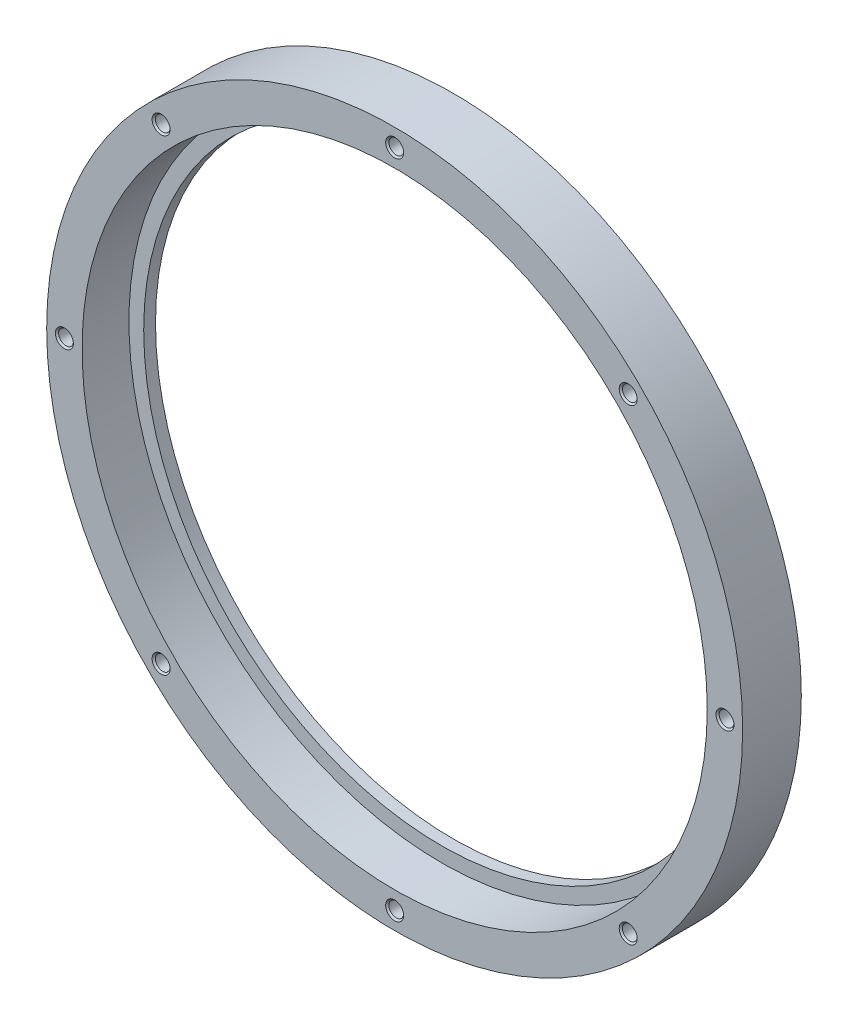
ISO-10303-21;
HEADER;
FILE_DESCRIPTION(('STEP AP214'),'2;1');
FILE_NAME('part.step','',(''),(''),'','','');
FILE_SCHEMA(('AUTOMOTIVE_DESIGN { 1 0 10303 214 1 1 1 1 }'));
ENDSEC;
DATA;
#1=APPLICATION_CONTEXT('core data for automotive mechanical design processes');
#2=APPLICATION_PROTOCOL_DEFINITION('international standard','automotive_design',2000,#1);
#3=PRODUCT_CONTEXT('',#1,'mechanical');
#4=PRODUCT('Part','Part','',(#3));
#5=PRODUCT_RELATED_PRODUCT_CATEGORY('part','',(#4));
#6=PRODUCT_DEFINITION_FORMATION('','',#4);
#7=PRODUCT_DEFINITION_CONTEXT('part definition',#1,'design');
#8=PRODUCT_DEFINITION('design','',#6,#7);
#9=PRODUCT_DEFINITION_SHAPE('','',#8);
#10=(LENGTH_UNIT() NAMED_UNIT(*) SI_UNIT(.MILLI.,.METRE.));
#11=(NAMED_UNIT(*) PLANE_ANGLE_UNIT() SI_UNIT($,.RADIAN.));
#12=(NAMED_UNIT(*) SI_UNIT($,.STERADIAN.) SOLID_ANGLE_UNIT());
#13=UNCERTAINTY_MEASURE_WITH_UNIT(LENGTH_MEASURE(1.E-05),#10,'distance_accuracy_value','');
#14=(GEOMETRIC_REPRESENTATION_CONTEXT(3) GLOBAL_UNCERTAINTY_ASSIGNED_CONTEXT((#13)) GLOBAL_UNIT_ASSIGNED_CONTEXT((#10,
#11,#12)) REPRESENTATION_CONTEXT('',''));
#15=CARTESIAN_POINT('',(0.,0.,0.));
#16=DIRECTION('',(0.,0.,1.));
#17=DIRECTION('',(1.,0.,0.));
#18=AXIS2_PLACEMENT_3D('',#15,#16,#17);
#19=CARTESIAN_POINT('',(0.,0.,3.975));
#20=DIRECTION('',(0.,0.,1.));
#21=DIRECTION('',(1.,0.,0.));
#22=AXIS2_PLACEMENT_3D('',#19,#20,#21);
#23=PLANE('',#22);
#24=CARTESIAN_POINT('',(-39.5979797464462,39.5979797464471,3.975));
#25=DIRECTION('',(0.,0.,1.));
#26=DIRECTION('',(1.,0.,0.));
#27=AXIS2_PLACEMENT_3D('',#24,#25,#26);
#28=CIRCLE('',#27,1.525);
#29=CARTESIAN_POINT('',(-38.0729797464462,39.5979797464471,3.975));
#30=VERTEX_POINT('',#29);
#31=EDGE_CURVE('E131',#30,#30,#28,.T.);
#32=ORIENTED_EDGE('',*,*,#31,.F.);
#33=EDGE_LOOP('',(#32));
#34=FACE_BOUND('',#33,.T.);
#35=CARTESIAN_POINT('',(-56.,5.86568864925646E-13,3.975));
#36=DIRECTION('',(0.,0.,1.));
#37=DIRECTION('',(1.,0.,0.));
#38=AXIS2_PLACEMENT_3D('',#35,#36,#37);
#39=CIRCLE('',#38,1.525);
#40=CARTESIAN_POINT('',(-54.475,5.86568864925646E-13,3.975));
#41=VERTEX_POINT('',#40);
#42=EDGE_CURVE('E122',#41,#41,#39,.T.);
#43=ORIENTED_EDGE('',*,*,#42,.F.);
#44=EDGE_LOOP('',(#43));
#45=FACE_BOUND('',#44,.T.);
#46=CARTESIAN_POINT('',(-39.597979746447,-39.5979797464463,3.975));
#47=DIRECTION('',(0.,0.,1.));
#48=DIRECTION('',(1.,0.,0.));
#49=AXIS2_PLACEMENT_3D('',#46,#47,#48);
#50=CIRCLE('',#49,1.525);
#51=CARTESIAN_POINT('',(-38.072979746447,-39.5979797464463,3.975));
#52=VERTEX_POINT('',#51);
#53=EDGE_CURVE('E113',#52,#52,#50,.T.);
#54=ORIENTED_EDGE('',*,*,#53,.F.);
#55=EDGE_LOOP('',(#54));
#56=FACE_BOUND('',#55,.T.);
#57=CARTESIAN_POINT('',(0.,-56.,3.975));
#58=DIRECTION('',(0.,0.,1.));
#59=DIRECTION('',(1.,0.,0.));
#60=AXIS2_PLACEMENT_3D('',#57,#58,#59);
#61=CIRCLE('',#60,1.525);
#62=CARTESIAN_POINT('',(1.525,-56.,3.975));
#63=VERTEX_POINT('',#62);
#64=EDGE_CURVE('E104',#63,#63,#61,.T.);
#65=ORIENTED_EDGE('',*,*,#64,.F.);
#66=EDGE_LOOP('',(#65));
#67=FACE_BOUND('',#66,.T.);
#68=CARTESIAN_POINT('',(39.5979797464464,-39.5979797464469,3.975));
#69=DIRECTION('',(0.,0.,1.));
#70=DIRECTION('',(1.,0.,0.));
#71=AXIS2_PLACEMENT_3D('',#68,#69,#70);
#72=CIRCLE('',#71,1.525);
#73=CARTESIAN_POINT('',(41.1229797464464,-39.5979797464469,3.975));
#74=VERTEX_POINT('',#73);
#75=EDGE_CURVE('E95',#74,#74,#72,.T.);
#76=ORIENTED_EDGE('',*,*,#75,.F.);
#77=EDGE_LOOP('',(#76));
#78=FACE_BOUND('',#77,.T.);
#79=CARTESIAN_POINT('',(56.,-1.95522954975215E-13,3.975));
#80=DIRECTION('',(0.,0.,1.));
#81=DIRECTION('',(1.,0.,0.));
#82=AXIS2_PLACEMENT_3D('',#79,#80,#81);
#83=CIRCLE('',#82,1.525);
#84=CARTESIAN_POINT('',(57.525,-1.95522954975215E-13,3.975));
#85=VERTEX_POINT('',#84);
#86=EDGE_CURVE('E86',#85,#85,#83,.T.);
#87=ORIENTED_EDGE('',*,*,#86,.F.);
#88=EDGE_LOOP('',(#87));
#89=FACE_BOUND('',#88,.T.);
#90=CARTESIAN_POINT('',(39.5979797464467,39.5979797464466,3.975));
#91=DIRECTION('',(0.,0.,1.));
#92=DIRECTION('',(1.,0.,0.));
#93=AXIS2_PLACEMENT_3D('',#90,#91,#92);
#94=CIRCLE('',#93,1.525);
#95=CARTESIAN_POINT('',(41.1229797464467,39.5979797464466,3.975));
#96=VERTEX_POINT('',#95);
#97=EDGE_CURVE('E77',#96,#96,#94,.T.);
#98=ORIENTED_EDGE('',*,*,#97,.F.);
#99=EDGE_LOOP('',(#98));
#100=FACE_BOUND('',#99,.T.);
#101=CARTESIAN_POINT('',(0.,56.,3.975));
#102=DIRECTION('',(0.,0.,1.));
#103=DIRECTION('',(1.,0.,0.));
#104=AXIS2_PLACEMENT_3D('',#101,#102,#103);
#105=CIRCLE('',#104,1.525);
#106=CARTESIAN_POINT('',(1.525,56.,3.975));
#107=VERTEX_POINT('',#106);
#108=EDGE_CURVE('E68',#107,#107,#105,.T.);
#109=ORIENTED_EDGE('',*,*,#108,.F.);
#110=EDGE_LOOP('',(#109));
#111=FACE_BOUND('',#110,.T.);
#112=CARTESIAN_POINT('',(0.,0.,3.975));
#113=DIRECTION('',(0.,0.,1.));
#114=DIRECTION('',(1.,0.,0.));
#115=AXIS2_PLACEMENT_3D('',#112,#113,#114);
#116=CIRCLE('',#115,59.);
#117=CARTESIAN_POINT('',(59.,0.,3.975));
#118=VERTEX_POINT('',#117);
#119=EDGE_CURVE('E10',#118,#118,#116,.T.);
#120=ORIENTED_EDGE('',*,*,#119,.T.);
#121=EDGE_LOOP('',(#120));
#122=FACE_BOUND('',#121,.T.);
#123=CARTESIAN_POINT('',(0.,0.,3.975));
#124=DIRECTION('',(0.,0.,1.));
#125=DIRECTION('',(1.,0.,0.));
#126=AXIS2_PLACEMENT_3D('',#123,#124,#125);
#127=CIRCLE('',#126,53.);
#128=CARTESIAN_POINT('',(53.,0.,3.975));
#129=VERTEX_POINT('',#128);
#130=EDGE_CURVE('E43',#129,#129,#127,.T.);
#131=ORIENTED_EDGE('',*,*,#130,.F.);
#132=EDGE_LOOP('',(#131));
#133=FACE_BOUND('',#132,.T.);
#134=ADVANCED_FACE('F36',(#34,#45,#56,#67,#78,#89,#100,#111,#122,#133),#23,.T.);
#135=CARTESIAN_POINT('',(0.,0.,3.975));
#136=DIRECTION('',(0.,0.,-1.));
#137=DIRECTION('',(-1.,0.,0.));
#138=AXIS2_PLACEMENT_3D('',#135,#136,#137);
#139=CYLINDRICAL_SURFACE('',#138,59.);
#140=ORIENTED_EDGE('',*,*,#119,.F.);
#141=EDGE_LOOP('',(#140));
#142=FACE_BOUND('',#141,.T.);
#143=CARTESIAN_POINT('',(0.,0.,-5.975));
#144=DIRECTION('',(0.,0.,-1.));
#145=DIRECTION('',(-1.,0.,0.));
#146=AXIS2_PLACEMENT_3D('',#143,#144,#145);
#147=CIRCLE('',#146,59.);
#148=CARTESIAN_POINT('',(-59.,0.,-5.975));
#149=VERTEX_POINT('',#148);
#150=EDGE_CURVE('E52',#149,#149,#147,.T.);
#151=ORIENTED_EDGE('',*,*,#150,.F.);
#152=EDGE_LOOP('',(#151));
#153=FACE_BOUND('',#152,.T.);
#154=ADVANCED_FACE('F38',(#142,#153),#139,.T.);
#155=CARTESIAN_POINT('',(0.,0.,3.975));
#156=DIRECTION('',(0.,0.,-1.));
#157=DIRECTION('',(-1.,0.,0.));
#158=AXIS2_PLACEMENT_3D('',#155,#156,#157);
#159=CYLINDRICAL_SURFACE('',#158,53.);
#160=ORIENTED_EDGE('',*,*,#130,.T.);
#161=EDGE_LOOP('',(#160));
#162=FACE_BOUND('',#161,.T.);
#163=CARTESIAN_POINT('',(0.,0.,-3.975));
#164=DIRECTION('',(0.,0.,1.));
#165=DIRECTION('',(1.,0.,0.));
#166=AXIS2_PLACEMENT_3D('',#163,#164,#165);
#167=CIRCLE('',#166,53.);
#168=CARTESIAN_POINT('',(53.,0.,-3.975));
#169=VERTEX_POINT('',#168);
#170=EDGE_CURVE('E47',#169,#169,#167,.T.);
#171=ORIENTED_EDGE('',*,*,#170,.F.);
#172=EDGE_LOOP('',(#171));
#173=FACE_BOUND('',#172,.T.);
#174=ADVANCED_FACE('F183',(#162,#173),#159,.F.);
#175=CARTESIAN_POINT('',(0.,0.,-3.975));
#176=DIRECTION('',(0.,0.,-1.));
#177=DIRECTION('',(-1.,0.,0.));
#178=AXIS2_PLACEMENT_3D('',#175,#176,#177);
#179=PLANE('',#178);
#180=CARTESIAN_POINT('',(0.,0.,-3.975));
#181=DIRECTION('',(0.,0.,-1.));
#182=DIRECTION('',(-1.,0.,0.));
#183=AXIS2_PLACEMENT_3D('',#180,#181,#182);
#184=CIRCLE('',#183,50.5);
#185=CARTESIAN_POINT('',(-50.5,0.,-3.975));
#186=VERTEX_POINT('',#185);
#187=EDGE_CURVE('E57',#186,#186,#184,.T.);
#188=ORIENTED_EDGE('',*,*,#187,.T.);
#189=EDGE_LOOP('',(#188));
#190=FACE_BOUND('',#189,.T.);
#191=ORIENTED_EDGE('',*,*,#170,.T.);
#192=EDGE_LOOP('',(#191));
#193=FACE_BOUND('',#192,.T.);
#194=ADVANCED_FACE('F179',(#190,#193),#179,.F.);
#195=CARTESIAN_POINT('',(0.,0.,-5.975));
#196=DIRECTION('',(0.,0.,-1.));
#197=DIRECTION('',(-1.,0.,0.));
#198=AXIS2_PLACEMENT_3D('',#195,#196,#197);
#199=PLANE('',#198);
#200=CARTESIAN_POINT('',(-39.5979797464462,39.5979797464471,-5.975));
#201=DIRECTION('',(0.,0.,1.));
#202=DIRECTION('',(1.,0.,0.));
#203=AXIS2_PLACEMENT_3D('',#200,#201,#202);
#204=CIRCLE('',#203,1.24999999999999);
#205=CARTESIAN_POINT('',(-38.3479797464462,39.5979797464471,-5.975));
#206=VERTEX_POINT('',#205);
#207=EDGE_CURVE('E125',#206,#206,#204,.T.);
#208=ORIENTED_EDGE('',*,*,#207,.T.);
#209=EDGE_LOOP('',(#208));
#210=FACE_BOUND('',#209,.T.);
#211=CARTESIAN_POINT('',(-56.,5.86568864925646E-13,-5.975));
#212=DIRECTION('',(0.,0.,1.));
#213=DIRECTION('',(1.,0.,0.));
#214=AXIS2_PLACEMENT_3D('',#211,#212,#213);
#215=CIRCLE('',#214,1.24999999999999);
#216=CARTESIAN_POINT('',(-54.75,5.86568864925646E-13,-5.975));
#217=VERTEX_POINT('',#216);
#218=EDGE_CURVE('E116',#217,#217,#215,.T.);
#219=ORIENTED_EDGE('',*,*,#218,.T.);
#220=EDGE_LOOP('',(#219));
#221=FACE_BOUND('',#220,.T.);
#222=CARTESIAN_POINT('',(-39.597979746447,-39.5979797464463,-5.975));
#223=DIRECTION('',(0.,0.,1.));
#224=DIRECTION('',(1.,0.,0.));
#225=AXIS2_PLACEMENT_3D('',#222,#223,#224);
#226=CIRCLE('',#225,1.24999999999999);
#227=CARTESIAN_POINT('',(-38.347979746447,-39.5979797464463,-5.975));
#228=VERTEX_POINT('',#227);
#229=EDGE_CURVE('E107',#228,#228,#226,.T.);
#230=ORIENTED_EDGE('',*,*,#229,.T.);
#231=EDGE_LOOP('',(#230));
#232=FACE_BOUND('',#231,.T.);
#233=CARTESIAN_POINT('',(0.,-56.,-5.975));
#234=DIRECTION('',(0.,0.,1.));
#235=DIRECTION('',(1.,0.,0.));
#236=AXIS2_PLACEMENT_3D('',#233,#234,#235);
#237=CIRCLE('',#236,1.25);
#238=CARTESIAN_POINT('',(1.25,-56.,-5.975));
#239=VERTEX_POINT('',#238);
#240=EDGE_CURVE('E98',#239,#239,#237,.T.);
#241=ORIENTED_EDGE('',*,*,#240,.T.);
#242=EDGE_LOOP('',(#241));
#243=FACE_BOUND('',#242,.T.);
#244=CARTESIAN_POINT('',(39.5979797464464,-39.5979797464469,-5.975));
#245=DIRECTION('',(0.,0.,1.));
#246=DIRECTION('',(1.,0.,0.));
#247=AXIS2_PLACEMENT_3D('',#244,#245,#246);
#248=CIRCLE('',#247,1.24999999999999);
#249=CARTESIAN_POINT('',(40.8479797464464,-39.5979797464469,-5.975));
#250=VERTEX_POINT('',#249);
#251=EDGE_CURVE('E89',#250,#250,#248,.T.);
#252=ORIENTED_EDGE('',*,*,#251,.T.);
#253=EDGE_LOOP('',(#252));
#254=FACE_BOUND('',#253,.T.);
#255=CARTESIAN_POINT('',(56.,-1.95522954975215E-13,-5.975));
#256=DIRECTION('',(0.,0.,1.));
#257=DIRECTION('',(1.,0.,0.));
#258=AXIS2_PLACEMENT_3D('',#255,#256,#257);
#259=CIRCLE('',#258,1.24999999999999);
#260=CARTESIAN_POINT('',(57.25,-1.95522954975215E-13,-5.975));
#261=VERTEX_POINT('',#260);
#262=EDGE_CURVE('E80',#261,#261,#259,.T.);
#263=ORIENTED_EDGE('',*,*,#262,.T.);
#264=EDGE_LOOP('',(#263));
#265=FACE_BOUND('',#264,.T.);
#266=CARTESIAN_POINT('',(39.5979797464467,39.5979797464466,-5.975));
#267=DIRECTION('',(0.,0.,1.));
#268=DIRECTION('',(1.,0.,0.));
#269=AXIS2_PLACEMENT_3D('',#266,#267,#268);
#270=CIRCLE('',#269,1.24999999999999);
#271=CARTESIAN_POINT('',(40.8479797464467,39.5979797464466,-5.975));
#272=VERTEX_POINT('',#271);
#273=EDGE_CURVE('E71',#272,#272,#270,.T.);
#274=ORIENTED_EDGE('',*,*,#273,.T.);
#275=EDGE_LOOP('',(#274));
#276=FACE_BOUND('',#275,.T.);
#277=CARTESIAN_POINT('',(0.,56.,-5.975));
#278=DIRECTION('',(0.,0.,1.));
#279=DIRECTION('',(1.,0.,0.));
#280=AXIS2_PLACEMENT_3D('',#277,#278,#279);
#281=CIRCLE('',#280,1.25);
#282=CARTESIAN_POINT('',(1.25,56.,-5.975));
#283=VERTEX_POINT('',#282);
#284=EDGE_CURVE('E60',#283,#283,#281,.T.);
#285=ORIENTED_EDGE('',*,*,#284,.T.);
#286=EDGE_LOOP('',(#285));
#287=FACE_BOUND('',#286,.T.);
#288=ORIENTED_EDGE('',*,*,#150,.T.);
#289=EDGE_LOOP('',(#288));
#290=FACE_BOUND('',#289,.T.);
#291=CARTESIAN_POINT('',(0.,0.,-5.975));
#292=DIRECTION('',(0.,0.,-1.));
#293=DIRECTION('',(-1.,0.,0.));
#294=AXIS2_PLACEMENT_3D('',#291,#292,#293);
#295=CIRCLE('',#294,50.5);
#296=CARTESIAN_POINT('',(-50.5,0.,-5.975));
#297=VERTEX_POINT('',#296);
#298=EDGE_CURVE('E56',#297,#297,#295,.T.);
#299=ORIENTED_EDGE('',*,*,#298,.F.);
#300=EDGE_LOOP('',(#299));
#301=FACE_BOUND('',#300,.T.);
#302=ADVANCED_FACE('F175',(#210,#221,#232,#243,#254,#265,#276,#287,#290,#301),#199,.T.);
#303=CARTESIAN_POINT('',(0.,0.,-5.975));
#304=DIRECTION('',(0.,0.,1.));
#305=DIRECTION('',(1.,0.,0.));
#306=AXIS2_PLACEMENT_3D('',#303,#304,#305);
#307=CYLINDRICAL_SURFACE('',#306,50.5);
#308=ORIENTED_EDGE('',*,*,#298,.T.);
#309=EDGE_LOOP('',(#308));
#310=FACE_BOUND('',#309,.T.);
#311=ORIENTED_EDGE('',*,*,#187,.F.);
#312=EDGE_LOOP('',(#311));
#313=FACE_BOUND('',#312,.T.);
#314=ADVANCED_FACE('F167',(#310,#313),#307,.F.);
#315=CARTESIAN_POINT('',(0.,56.,3.975));
#316=DIRECTION('',(0.,0.,1.));
#317=DIRECTION('',(1.,0.,0.));
#318=AXIS2_PLACEMENT_3D('',#315,#316,#317);
#319=CYLINDRICAL_SURFACE('',#318,1.25);
#320=ORIENTED_EDGE('',*,*,#284,.F.);
#321=EDGE_LOOP('',(#320));
#322=FACE_BOUND('',#321,.T.);
#323=CARTESIAN_POINT('',(0.,56.,3.7));
#324=DIRECTION('',(0.,0.,1.));
#325=DIRECTION('',(1.,0.,0.));
#326=AXIS2_PLACEMENT_3D('',#323,#324,#325);
#327=CIRCLE('',#326,1.25);
#328=CARTESIAN_POINT('',(1.25,56.,3.7));
#329=VERTEX_POINT('',#328);
#330=EDGE_CURVE('E65',#329,#329,#327,.T.);
#331=ORIENTED_EDGE('',*,*,#330,.T.);
#332=EDGE_LOOP('',(#331));
#333=FACE_BOUND('',#332,.T.);
#334=ADVANCED_FACE('F157',(#322,#333),#319,.F.);
#335=CARTESIAN_POINT('',(0.,56.,3.975));
#336=DIRECTION('',(0.,0.,1.));
#337=DIRECTION('',(1.,0.,0.));
#338=AXIS2_PLACEMENT_3D('',#335,#336,#337);
#339=CONICAL_SURFACE('',#338,1.525,0.785398163397448);
#340=ORIENTED_EDGE('',*,*,#330,.F.);
#341=EDGE_LOOP('',(#340));
#342=FACE_BOUND('',#341,.T.);
#343=ORIENTED_EDGE('',*,*,#108,.T.);
#344=EDGE_LOOP('',(#343));
#345=FACE_BOUND('',#344,.T.);
#346=ADVANCED_FACE('F154',(#342,#345),#339,.F.);
#347=CARTESIAN_POINT('',(39.5979797464467,39.5979797464466,3.975));
#348=DIRECTION('',(0.,0.,1.));
#349=DIRECTION('',(1.,0.,0.));
#350=AXIS2_PLACEMENT_3D('',#347,#348,#349);
#351=CYLINDRICAL_SURFACE('',#350,1.24999999999999);
#352=ORIENTED_EDGE('',*,*,#273,.F.);
#353=EDGE_LOOP('',(#352));
#354=FACE_BOUND('',#353,.T.);
#355=CARTESIAN_POINT('',(39.5979797464467,39.5979797464466,3.7));
#356=DIRECTION('',(0.,0.,1.));
#357=DIRECTION('',(1.,0.,0.));
#358=AXIS2_PLACEMENT_3D('',#355,#356,#357);
#359=CIRCLE('',#358,1.24999999999999);
#360=CARTESIAN_POINT('',(40.8479797464467,39.5979797464466,3.7));
#361=VERTEX_POINT('',#360);
#362=EDGE_CURVE('E74',#361,#361,#359,.T.);
#363=ORIENTED_EDGE('',*,*,#362,.T.);
#364=EDGE_LOOP('',(#363));
#365=FACE_BOUND('',#364,.T.);
#366=ADVANCED_FACE('F156',(#354,#365),#351,.F.);
#367=CARTESIAN_POINT('',(39.5979797464467,39.5979797464466,3.975));
#368=DIRECTION('',(0.,0.,1.));
#369=DIRECTION('',(1.,0.,0.));
#370=AXIS2_PLACEMENT_3D('',#367,#368,#369);
#371=CONICAL_SURFACE('',#370,1.525,0.785398163397451);
#372=ORIENTED_EDGE('',*,*,#362,.F.);
#373=EDGE_LOOP('',(#372));
#374=FACE_BOUND('',#373,.T.);
#375=ORIENTED_EDGE('',*,*,#97,.T.);
#376=EDGE_LOOP('',(#375));
#377=FACE_BOUND('',#376,.T.);
#378=ADVANCED_FACE('F164',(#374,#377),#371,.F.);
#379=CARTESIAN_POINT('',(56.,-1.95522954975215E-13,3.975));
#380=DIRECTION('',(0.,0.,1.));
#381=DIRECTION('',(1.,0.,0.));
#382=AXIS2_PLACEMENT_3D('',#379,#380,#381);
#383=CYLINDRICAL_SURFACE('',#382,1.24999999999999);
#384=ORIENTED_EDGE('',*,*,#262,.F.);
#385=EDGE_LOOP('',(#384));
#386=FACE_BOUND('',#385,.T.);
#387=CARTESIAN_POINT('',(56.,-1.95522954975215E-13,3.7));
#388=DIRECTION('',(0.,0.,1.));
#389=DIRECTION('',(1.,0.,0.));
#390=AXIS2_PLACEMENT_3D('',#387,#388,#389);
#391=CIRCLE('',#390,1.24999999999999);
#392=CARTESIAN_POINT('',(57.25,-1.95522954975215E-13,3.7));
#393=VERTEX_POINT('',#392);
#394=EDGE_CURVE('E83',#393,#393,#391,.T.);
#395=ORIENTED_EDGE('',*,*,#394,.T.);
#396=EDGE_LOOP('',(#395));
#397=FACE_BOUND('',#396,.T.);
#398=ADVANCED_FACE('F237',(#386,#397),#383,.F.);
#399=CARTESIAN_POINT('',(56.,-1.95522954975215E-13,3.975));
#400=DIRECTION('',(0.,0.,1.));
#401=DIRECTION('',(1.,0.,0.));
#402=AXIS2_PLACEMENT_3D('',#399,#400,#401);
#403=CONICAL_SURFACE('',#402,1.525,0.785398163397451);
#404=ORIENTED_EDGE('',*,*,#394,.F.);
#405=EDGE_LOOP('',(#404));
#406=FACE_BOUND('',#405,.T.);
#407=ORIENTED_EDGE('',*,*,#86,.T.);
#408=EDGE_LOOP('',(#407));
#409=FACE_BOUND('',#408,.T.);
#410=ADVANCED_FACE('F246',(#406,#409),#403,.F.);
#411=CARTESIAN_POINT('',(39.5979797464464,-39.5979797464469,3.975));
#412=DIRECTION('',(0.,0.,1.));
#413=DIRECTION('',(1.,0.,0.));
#414=AXIS2_PLACEMENT_3D('',#411,#412,#413);
#415=CYLINDRICAL_SURFACE('',#414,1.25);
#416=ORIENTED_EDGE('',*,*,#251,.F.);
#417=EDGE_LOOP('',(#416));
#418=FACE_BOUND('',#417,.T.);
#419=CARTESIAN_POINT('',(39.5979797464464,-39.5979797464469,3.7));
#420=DIRECTION('',(0.,0.,1.));
#421=DIRECTION('',(1.,0.,0.));
#422=AXIS2_PLACEMENT_3D('',#419,#420,#421);
#423=CIRCLE('',#422,1.25);
#424=CARTESIAN_POINT('',(40.8479797464465,-39.5979797464469,3.7));
#425=VERTEX_POINT('',#424);
#426=EDGE_CURVE('E92',#425,#425,#423,.T.);
#427=ORIENTED_EDGE('',*,*,#426,.T.);
#428=EDGE_LOOP('',(#427));
#429=FACE_BOUND('',#428,.T.);
#430=ADVANCED_FACE('F257',(#418,#429),#415,.F.);
#431=CARTESIAN_POINT('',(39.5979797464464,-39.5979797464469,3.975));
#432=DIRECTION('',(0.,0.,1.));
#433=DIRECTION('',(1.,0.,0.));
#434=AXIS2_PLACEMENT_3D('',#431,#432,#433);
#435=CONICAL_SURFACE('',#434,1.525,0.785398163397439);
#436=ORIENTED_EDGE('',*,*,#426,.F.);
#437=EDGE_LOOP('',(#436));
#438=FACE_BOUND('',#437,.T.);
#439=ORIENTED_EDGE('',*,*,#75,.T.);
#440=EDGE_LOOP('',(#439));
#441=FACE_BOUND('',#440,.T.);
#442=ADVANCED_FACE('F267',(#438,#441),#435,.F.);
#443=CARTESIAN_POINT('',(0.,-56.,3.975));
#444=DIRECTION('',(0.,0.,1.));
#445=DIRECTION('',(1.,0.,0.));
#446=AXIS2_PLACEMENT_3D('',#443,#444,#445);
#447=CYLINDRICAL_SURFACE('',#446,1.25);
#448=ORIENTED_EDGE('',*,*,#240,.F.);
#449=EDGE_LOOP('',(#448));
#450=FACE_BOUND('',#449,.T.);
#451=CARTESIAN_POINT('',(0.,-56.,3.7));
#452=DIRECTION('',(0.,0.,1.));
#453=DIRECTION('',(1.,0.,0.));
#454=AXIS2_PLACEMENT_3D('',#451,#452,#453);
#455=CIRCLE('',#454,1.25);
#456=CARTESIAN_POINT('',(1.25,-56.,3.7));
#457=VERTEX_POINT('',#456);
#458=EDGE_CURVE('E101',#457,#457,#455,.T.);
#459=ORIENTED_EDGE('',*,*,#458,.T.);
#460=EDGE_LOOP('',(#459));
#461=FACE_BOUND('',#460,.T.);
#462=ADVANCED_FACE('F278',(#450,#461),#447,.F.);
#463=CARTESIAN_POINT('',(0.,-56.,3.975));
#464=DIRECTION('',(0.,0.,1.));
#465=DIRECTION('',(1.,0.,0.));
#466=AXIS2_PLACEMENT_3D('',#463,#464,#465);
#467=CONICAL_SURFACE('',#466,1.525,0.785398163397448);
#468=ORIENTED_EDGE('',*,*,#458,.F.);
#469=EDGE_LOOP('',(#468));
#470=FACE_BOUND('',#469,.T.);
#471=ORIENTED_EDGE('',*,*,#64,.T.);
#472=EDGE_LOOP('',(#471));
#473=FACE_BOUND('',#472,.T.);
#474=ADVANCED_FACE('F288',(#470,#473),#467,.F.);
#475=CARTESIAN_POINT('',(-39.597979746447,-39.5979797464463,3.975));
#476=DIRECTION('',(0.,0.,1.));
#477=DIRECTION('',(1.,0.,0.));
#478=AXIS2_PLACEMENT_3D('',#475,#476,#477);
#479=CYLINDRICAL_SURFACE('',#478,1.25);
#480=ORIENTED_EDGE('',*,*,#229,.F.);
#481=EDGE_LOOP('',(#480));
#482=FACE_BOUND('',#481,.T.);
#483=CARTESIAN_POINT('',(-39.597979746447,-39.5979797464463,3.7));
#484=DIRECTION('',(0.,0.,1.));
#485=DIRECTION('',(1.,0.,0.));
#486=AXIS2_PLACEMENT_3D('',#483,#484,#485);
#487=CIRCLE('',#486,1.25);
#488=CARTESIAN_POINT('',(-38.347979746447,-39.5979797464463,3.7));
#489=VERTEX_POINT('',#488);
#490=EDGE_CURVE('E110',#489,#489,#487,.T.);
#491=ORIENTED_EDGE('',*,*,#490,.T.);
#492=EDGE_LOOP('',(#491));
#493=FACE_BOUND('',#492,.T.);
#494=ADVANCED_FACE('F299',(#482,#493),#479,.F.);
#495=CARTESIAN_POINT('',(-39.597979746447,-39.5979797464463,3.975));
#496=DIRECTION('',(0.,0.,1.));
#497=DIRECTION('',(1.,0.,0.));
#498=AXIS2_PLACEMENT_3D('',#495,#496,#497);
#499=CONICAL_SURFACE('',#498,1.525,0.785398163397439);
#500=ORIENTED_EDGE('',*,*,#490,.F.);
#501=EDGE_LOOP('',(#500));
#502=FACE_BOUND('',#501,.T.);
#503=ORIENTED_EDGE('',*,*,#53,.T.);
#504=EDGE_LOOP('',(#503));
#505=FACE_BOUND('',#504,.T.);
#506=ADVANCED_FACE('F309',(#502,#505),#499,.F.);
#507=CARTESIAN_POINT('',(-56.,5.86568864925646E-13,3.975));
#508=DIRECTION('',(0.,0.,1.));
#509=DIRECTION('',(1.,0.,0.));
#510=AXIS2_PLACEMENT_3D('',#507,#508,#509);
#511=CYLINDRICAL_SURFACE('',#510,1.24999999999999);
#512=ORIENTED_EDGE('',*,*,#218,.F.);
#513=EDGE_LOOP('',(#512));
#514=FACE_BOUND('',#513,.T.);
#515=CARTESIAN_POINT('',(-56.,5.86568864925646E-13,3.7));
#516=DIRECTION('',(0.,0.,1.));
#517=DIRECTION('',(1.,0.,0.));
#518=AXIS2_PLACEMENT_3D('',#515,#516,#517);
#519=CIRCLE('',#518,1.24999999999999);
#520=CARTESIAN_POINT('',(-54.75,5.86568864925646E-13,3.7));
#521=VERTEX_POINT('',#520);
#522=EDGE_CURVE('E119',#521,#521,#519,.T.);
#523=ORIENTED_EDGE('',*,*,#522,.T.);
#524=EDGE_LOOP('',(#523));
#525=FACE_BOUND('',#524,.T.);
#526=ADVANCED_FACE('F320',(#514,#525),#511,.F.);
#527=CARTESIAN_POINT('',(-56.,5.86568864925646E-13,3.975));
#528=DIRECTION('',(0.,0.,1.));
#529=DIRECTION('',(1.,0.,0.));
#530=AXIS2_PLACEMENT_3D('',#527,#528,#529);
#531=CONICAL_SURFACE('',#530,1.525,0.785398163397451);
#532=ORIENTED_EDGE('',*,*,#522,.F.);
#533=EDGE_LOOP('',(#532));
#534=FACE_BOUND('',#533,.T.);
#535=ORIENTED_EDGE('',*,*,#42,.T.);
#536=EDGE_LOOP('',(#535));
#537=FACE_BOUND('',#536,.T.);
#538=ADVANCED_FACE('F331',(#534,#537),#531,.F.);
#539=CARTESIAN_POINT('',(-39.5979797464462,39.5979797464471,3.975));
#540=DIRECTION('',(0.,0.,1.));
#541=DIRECTION('',(1.,0.,0.));
#542=AXIS2_PLACEMENT_3D('',#539,#540,#541);
#543=CYLINDRICAL_SURFACE('',#542,1.24999999999999);
#544=ORIENTED_EDGE('',*,*,#207,.F.);
#545=EDGE_LOOP('',(#544));
#546=FACE_BOUND('',#545,.T.);
#547=CARTESIAN_POINT('',(-39.5979797464462,39.5979797464471,3.7));
#548=DIRECTION('',(0.,0.,1.));
#549=DIRECTION('',(1.,0.,0.));
#550=AXIS2_PLACEMENT_3D('',#547,#548,#549);
#551=CIRCLE('',#550,1.24999999999999);
#552=CARTESIAN_POINT('',(-38.3479797464462,39.5979797464471,3.7));
#553=VERTEX_POINT('',#552);
#554=EDGE_CURVE('E128',#553,#553,#551,.T.);
#555=ORIENTED_EDGE('',*,*,#554,.T.);
#556=EDGE_LOOP('',(#555));
#557=FACE_BOUND('',#556,.T.);
#558=ADVANCED_FACE('F341',(#546,#557),#543,.F.);
#559=CARTESIAN_POINT('',(-39.5979797464462,39.5979797464471,3.975));
#560=DIRECTION('',(0.,0.,1.));
#561=DIRECTION('',(1.,0.,0.));
#562=AXIS2_PLACEMENT_3D('',#559,#560,#561);
#563=CONICAL_SURFACE('',#562,1.525,0.785398163397451);
#564=ORIENTED_EDGE('',*,*,#554,.F.);
#565=EDGE_LOOP('',(#564));
#566=FACE_BOUND('',#565,.T.);
#567=ORIENTED_EDGE('',*,*,#31,.T.);
#568=EDGE_LOOP('',(#567));
#569=FACE_BOUND('',#568,.T.);
#570=ADVANCED_FACE('F135',(#566,#569),#563,.F.);
#571=CLOSED_SHELL('',(#134,#154,#174,#194,#302,#314,#334,#346,#366,#378,#398,#410,#430,#442,
#462,#474,#494,#506,#526,#538,#558,#570));
#572=MANIFOLD_SOLID_BREP('B2',#571);
#573=ADVANCED_BREP_SHAPE_REPRESENTATION('',(#18,#572),#14);
#574=SHAPE_DEFINITION_REPRESENTATION(#9,#573);
ENDSEC;
END-ISO-10303-21;
